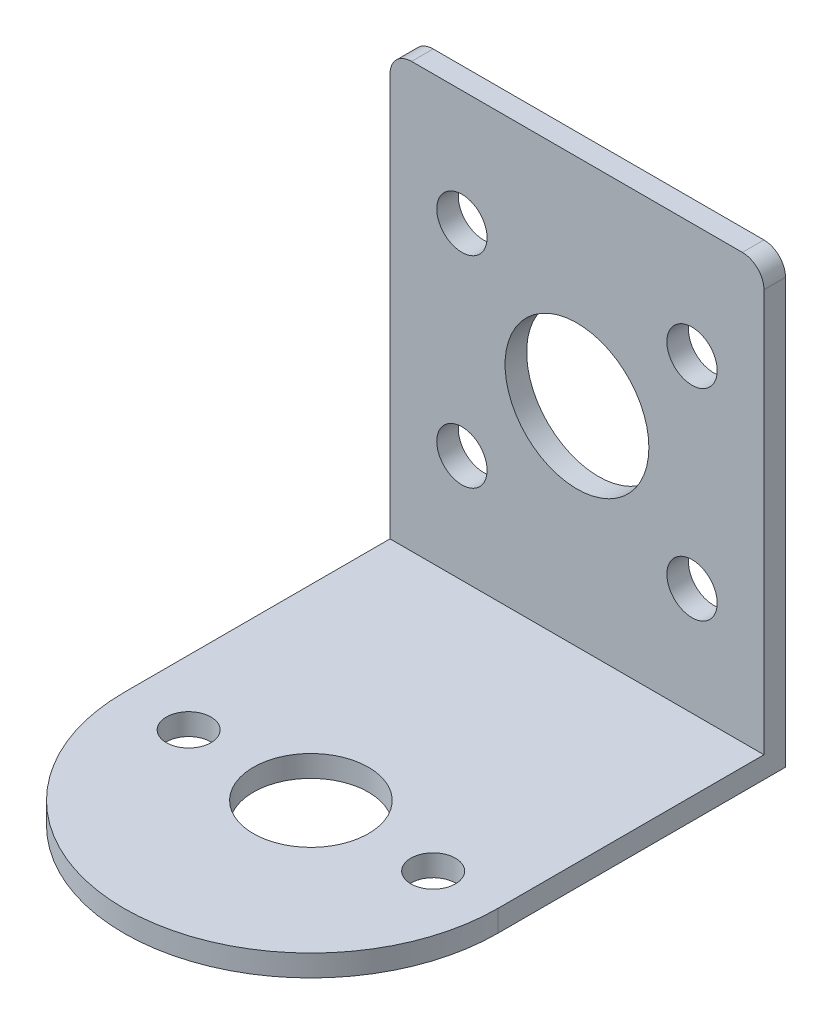
ISO-10303-21;
HEADER;
FILE_DESCRIPTION(('STEP AP214'),'2;1');
FILE_NAME('part.step','',(''),(''),'','','');
FILE_SCHEMA(('AUTOMOTIVE_DESIGN { 1 0 10303 214 1 1 1 1 }'));
ENDSEC;
DATA;
#1=APPLICATION_CONTEXT('core data for automotive mechanical design processes');
#2=APPLICATION_PROTOCOL_DEFINITION('international standard','automotive_design',2000,#1);
#3=PRODUCT_CONTEXT('',#1,'mechanical');
#4=PRODUCT('Part','Part','',(#3));
#5=PRODUCT_RELATED_PRODUCT_CATEGORY('part','',(#4));
#6=PRODUCT_DEFINITION_FORMATION('','',#4);
#7=PRODUCT_DEFINITION_CONTEXT('part definition',#1,'design');
#8=PRODUCT_DEFINITION('design','',#6,#7);
#9=PRODUCT_DEFINITION_SHAPE('','',#8);
#10=(LENGTH_UNIT() NAMED_UNIT(*) SI_UNIT(.MILLI.,.METRE.));
#11=(NAMED_UNIT(*) PLANE_ANGLE_UNIT() SI_UNIT($,.RADIAN.));
#12=(NAMED_UNIT(*) SI_UNIT($,.STERADIAN.) SOLID_ANGLE_UNIT());
#13=UNCERTAINTY_MEASURE_WITH_UNIT(LENGTH_MEASURE(1.E-05),#10,'distance_accuracy_value','');
#14=(GEOMETRIC_REPRESENTATION_CONTEXT(3) GLOBAL_UNCERTAINTY_ASSIGNED_CONTEXT((#13)) GLOBAL_UNIT_ASSIGNED_CONTEXT((#10,
#11,#12)) REPRESENTATION_CONTEXT('',''));
#15=CARTESIAN_POINT('',(0.,0.,0.));
#16=DIRECTION('',(0.,0.,1.));
#17=DIRECTION('',(1.,0.,0.));
#18=AXIS2_PLACEMENT_3D('',#15,#16,#17);
#19=CARTESIAN_POINT('',(0.,0.,1.5));
#20=DIRECTION('',(0.,0.,1.));
#21=DIRECTION('',(1.,0.,0.));
#22=AXIS2_PLACEMENT_3D('',#19,#20,#21);
#23=PLANE('',#22);
#24=CARTESIAN_POINT('',(8.,-6.5,1.5));
#25=DIRECTION('',(0.,0.,1.));
#26=DIRECTION('',(-1.,0.,0.));
#27=AXIS2_PLACEMENT_3D('',#24,#25,#26);
#28=CIRCLE('',#27,1.75);
#29=CARTESIAN_POINT('',(6.25,-6.5,1.5));
#30=VERTEX_POINT('',#29);
#31=EDGE_CURVE('E436',#30,#30,#28,.T.);
#32=ORIENTED_EDGE('',*,*,#31,.F.);
#33=EDGE_LOOP('',(#32));
#34=FACE_BOUND('',#33,.T.);
#35=CARTESIAN_POINT('',(-8.,-6.5,1.5));
#36=DIRECTION('',(0.,0.,1.));
#37=DIRECTION('',(-1.,0.,0.));
#38=AXIS2_PLACEMENT_3D('',#35,#36,#37);
#39=CIRCLE('',#38,1.75);
#40=CARTESIAN_POINT('',(-9.75,-6.5,1.5));
#41=VERTEX_POINT('',#40);
#42=EDGE_CURVE('E438',#41,#41,#39,.T.);
#43=ORIENTED_EDGE('',*,*,#42,.F.);
#44=EDGE_LOOP('',(#43));
#45=FACE_BOUND('',#44,.T.);
#46=CARTESIAN_POINT('',(8.,7.5,1.5));
#47=DIRECTION('',(0.,0.,1.));
#48=DIRECTION('',(1.,0.,0.));
#49=AXIS2_PLACEMENT_3D('',#46,#47,#48);
#50=CIRCLE('',#49,1.75);
#51=CARTESIAN_POINT('',(9.75,7.5,1.5));
#52=VERTEX_POINT('',#51);
#53=EDGE_CURVE('E442',#52,#52,#50,.T.);
#54=ORIENTED_EDGE('',*,*,#53,.F.);
#55=EDGE_LOOP('',(#54));
#56=FACE_BOUND('',#55,.T.);
#57=CARTESIAN_POINT('',(-8.,7.5,1.5));
#58=DIRECTION('',(0.,0.,1.));
#59=DIRECTION('',(1.,0.,0.));
#60=AXIS2_PLACEMENT_3D('',#57,#58,#59);
#61=CIRCLE('',#60,1.75);
#62=CARTESIAN_POINT('',(-6.25,7.5,1.5));
#63=VERTEX_POINT('',#62);
#64=EDGE_CURVE('E447',#63,#63,#61,.T.);
#65=ORIENTED_EDGE('',*,*,#64,.F.);
#66=EDGE_LOOP('',(#65));
#67=FACE_BOUND('',#66,.T.);
#68=CARTESIAN_POINT('',(0.,0.499999999999996,1.5));
#69=DIRECTION('',(0.,0.,1.));
#70=DIRECTION('',(1.,0.,0.));
#71=AXIS2_PLACEMENT_3D('',#68,#69,#70);
#72=CIRCLE('',#71,5.);
#73=CARTESIAN_POINT('',(5.,0.499999999999996,1.5));
#74=VERTEX_POINT('',#73);
#75=EDGE_CURVE('E212',#74,#74,#72,.T.);
#76=ORIENTED_EDGE('',*,*,#75,.F.);
#77=EDGE_LOOP('',(#76));
#78=FACE_BOUND('',#77,.T.);
#79=DIRECTION('',(0.,1.,0.));
#80=VECTOR('',#79,1.);
#81=CARTESIAN_POINT('',(13.,15.5,1.5));
#82=LINE('',#81,#80);
#83=CARTESIAN_POINT('',(13.,-14.,1.5));
#84=VERTEX_POINT('',#83);
#85=CARTESIAN_POINT('',(13.,14.,1.5));
#86=VERTEX_POINT('',#85);
#87=EDGE_CURVE('E116',#84,#86,#82,.T.);
#88=ORIENTED_EDGE('',*,*,#87,.T.);
#89=CARTESIAN_POINT('',(11.5,14.,1.5));
#90=DIRECTION('',(0.,0.,1.));
#91=DIRECTION('',(1.,0.,0.));
#92=AXIS2_PLACEMENT_3D('',#89,#90,#91);
#93=CIRCLE('',#92,1.5);
#94=CARTESIAN_POINT('',(11.5,15.5,1.5));
#95=VERTEX_POINT('',#94);
#96=EDGE_CURVE('E50',#86,#95,#93,.T.);
#97=ORIENTED_EDGE('',*,*,#96,.T.);
#98=DIRECTION('',(-1.,0.,0.));
#99=VECTOR('',#98,1.);
#100=CARTESIAN_POINT('',(-13.,15.5,1.5));
#101=LINE('',#100,#99);
#102=CARTESIAN_POINT('',(-11.5,15.5,1.5));
#103=VERTEX_POINT('',#102);
#104=EDGE_CURVE('E151',#95,#103,#101,.T.);
#105=ORIENTED_EDGE('',*,*,#104,.T.);
#106=CARTESIAN_POINT('',(-11.5,14.,1.5));
#107=DIRECTION('',(0.,0.,1.));
#108=DIRECTION('',(1.,0.,0.));
#109=AXIS2_PLACEMENT_3D('',#106,#107,#108);
#110=CIRCLE('',#109,1.5);
#111=CARTESIAN_POINT('',(-13.,14.,1.5));
#112=VERTEX_POINT('',#111);
#113=EDGE_CURVE('E58',#103,#112,#110,.T.);
#114=ORIENTED_EDGE('',*,*,#113,.T.);
#115=DIRECTION('',(0.,-1.,0.));
#116=VECTOR('',#115,1.);
#117=CARTESIAN_POINT('',(-13.,15.5,1.5));
#118=LINE('',#117,#116);
#119=CARTESIAN_POINT('',(-13.,-14.,1.5));
#120=VERTEX_POINT('',#119);
#121=EDGE_CURVE('E155',#112,#120,#118,.T.);
#122=ORIENTED_EDGE('',*,*,#121,.T.);
#123=DIRECTION('',(1.,0.,0.));
#124=VECTOR('',#123,1.);
#125=CARTESIAN_POINT('',(0.,-14.,1.5));
#126=LINE('',#125,#124);
#127=EDGE_CURVE('E144',#120,#84,#126,.T.);
#128=ORIENTED_EDGE('',*,*,#127,.T.);
#129=EDGE_LOOP('',(#88,#97,#105,#114,#122,#128));
#130=FACE_BOUND('',#129,.T.);
#131=ADVANCED_FACE('F40',(#34,#45,#56,#67,#78,#130),#23,.T.);
#132=CARTESIAN_POINT('',(13.,15.5,1.5));
#133=DIRECTION('',(-1.,0.,0.));
#134=DIRECTION('',(0.,-1.,0.));
#135=AXIS2_PLACEMENT_3D('',#132,#133,#134);
#136=PLANE('',#135);
#137=DIRECTION('',(0.,1.,0.));
#138=VECTOR('',#137,1.);
#139=CARTESIAN_POINT('',(13.,15.5,0.));
#140=LINE('',#139,#138);
#141=CARTESIAN_POINT('',(13.,-15.5,0.));
#142=VERTEX_POINT('',#141);
#143=CARTESIAN_POINT('',(13.,14.,0.));
#144=VERTEX_POINT('',#143);
#145=EDGE_CURVE('E148',#142,#144,#140,.T.);
#146=ORIENTED_EDGE('',*,*,#145,.T.);
#147=DIRECTION('',(0.,0.,-1.));
#148=VECTOR('',#147,1.);
#149=CARTESIAN_POINT('',(13.,14.,1.5));
#150=LINE('',#149,#148);
#151=EDGE_CURVE('E66',#144,#86,#150,.F.);
#152=ORIENTED_EDGE('',*,*,#151,.T.);
#153=ORIENTED_EDGE('',*,*,#87,.F.);
#154=DIRECTION('',(0.,0.,1.));
#155=VECTOR('',#154,1.);
#156=CARTESIAN_POINT('',(13.,-14.,0.));
#157=LINE('',#156,#155);
#158=CARTESIAN_POINT('',(13.,-14.,20.));
#159=VERTEX_POINT('',#158);
#160=EDGE_CURVE('E110',#84,#159,#157,.T.);
#161=ORIENTED_EDGE('',*,*,#160,.T.);
#162=DIRECTION('',(0.,-1.,0.));
#163=VECTOR('',#162,1.);
#164=CARTESIAN_POINT('',(13.,-14.,20.));
#165=LINE('',#164,#163);
#166=CARTESIAN_POINT('',(13.,-15.5,20.));
#167=VERTEX_POINT('',#166);
#168=EDGE_CURVE('E114',#159,#167,#165,.T.);
#169=ORIENTED_EDGE('',*,*,#168,.T.);
#170=DIRECTION('',(0.,0.,-1.));
#171=VECTOR('',#170,1.);
#172=CARTESIAN_POINT('',(13.,-15.5,1.5));
#173=LINE('',#172,#171);
#174=EDGE_CURVE('E158',#167,#142,#173,.T.);
#175=ORIENTED_EDGE('',*,*,#174,.T.);
#176=EDGE_LOOP('',(#146,#152,#153,#161,#169,#175));
#177=FACE_BOUND('',#176,.T.);
#178=ADVANCED_FACE('F112',(#177),#136,.F.);
#179=CARTESIAN_POINT('',(-13.,15.5,1.5));
#180=DIRECTION('',(0.,-1.,0.));
#181=DIRECTION('',(0.,0.,-1.));
#182=AXIS2_PLACEMENT_3D('',#179,#180,#181);
#183=PLANE('',#182);
#184=ORIENTED_EDGE('',*,*,#104,.F.);
#185=DIRECTION('',(0.,0.,-1.));
#186=VECTOR('',#185,1.);
#187=CARTESIAN_POINT('',(11.5,15.5,1.5));
#188=LINE('',#187,#186);
#189=CARTESIAN_POINT('',(11.5,15.5,0.));
#190=VERTEX_POINT('',#189);
#191=EDGE_CURVE('E191',#95,#190,#188,.T.);
#192=ORIENTED_EDGE('',*,*,#191,.T.);
#193=DIRECTION('',(-1.,0.,0.));
#194=VECTOR('',#193,1.);
#195=CARTESIAN_POINT('',(-13.,15.5,0.));
#196=LINE('',#195,#194);
#197=CARTESIAN_POINT('',(-11.5,15.5,0.));
#198=VERTEX_POINT('',#197);
#199=EDGE_CURVE('E161',#190,#198,#196,.T.);
#200=ORIENTED_EDGE('',*,*,#199,.T.);
#201=DIRECTION('',(0.,0.,-1.));
#202=VECTOR('',#201,1.);
#203=CARTESIAN_POINT('',(-11.5,15.5,1.5));
#204=LINE('',#203,#202);
#205=EDGE_CURVE('E176',#198,#103,#204,.F.);
#206=ORIENTED_EDGE('',*,*,#205,.T.);
#207=EDGE_LOOP('',(#184,#192,#200,#206));
#208=FACE_BOUND('',#207,.T.);
#209=ADVANCED_FACE('F260',(#208),#183,.F.);
#210=CARTESIAN_POINT('',(-13.,15.5,1.5));
#211=DIRECTION('',(1.,0.,0.));
#212=DIRECTION('',(0.,1.,0.));
#213=AXIS2_PLACEMENT_3D('',#210,#211,#212);
#214=PLANE('',#213);
#215=ORIENTED_EDGE('',*,*,#121,.F.);
#216=DIRECTION('',(0.,0.,-1.));
#217=VECTOR('',#216,1.);
#218=CARTESIAN_POINT('',(-13.,14.,1.5));
#219=LINE('',#218,#217);
#220=CARTESIAN_POINT('',(-13.,14.,0.));
#221=VERTEX_POINT('',#220);
#222=EDGE_CURVE('E11',#112,#221,#219,.T.);
#223=ORIENTED_EDGE('',*,*,#222,.T.);
#224=DIRECTION('',(0.,-1.,0.));
#225=VECTOR('',#224,1.);
#226=CARTESIAN_POINT('',(-13.,15.5,0.));
#227=LINE('',#226,#225);
#228=CARTESIAN_POINT('',(-13.,-15.5,0.));
#229=VERTEX_POINT('',#228);
#230=EDGE_CURVE('E165',#221,#229,#227,.T.);
#231=ORIENTED_EDGE('',*,*,#230,.T.);
#232=DIRECTION('',(0.,0.,-1.));
#233=VECTOR('',#232,1.);
#234=CARTESIAN_POINT('',(-13.,-15.5,1.5));
#235=LINE('',#234,#233);
#236=CARTESIAN_POINT('',(-13.,-15.5,20.));
#237=VERTEX_POINT('',#236);
#238=EDGE_CURVE('E172',#237,#229,#235,.T.);
#239=ORIENTED_EDGE('',*,*,#238,.F.);
#240=DIRECTION('',(0.,-1.,0.));
#241=VECTOR('',#240,1.);
#242=CARTESIAN_POINT('',(-13.,-14.,20.));
#243=LINE('',#242,#241);
#244=CARTESIAN_POINT('',(-13.,-14.,20.));
#245=VERTEX_POINT('',#244);
#246=EDGE_CURVE('E131',#245,#237,#243,.T.);
#247=ORIENTED_EDGE('',*,*,#246,.F.);
#248=DIRECTION('',(0.,0.,-1.));
#249=VECTOR('',#248,1.);
#250=CARTESIAN_POINT('',(-13.,-14.,0.));
#251=LINE('',#250,#249);
#252=EDGE_CURVE('E122',#245,#120,#251,.T.);
#253=ORIENTED_EDGE('',*,*,#252,.T.);
#254=EDGE_LOOP('',(#215,#223,#231,#239,#247,#253));
#255=FACE_BOUND('',#254,.T.);
#256=ADVANCED_FACE('F244',(#255),#214,.F.);
#257=CARTESIAN_POINT('',(-13.,-15.5,1.5));
#258=DIRECTION('',(0.,1.,0.));
#259=DIRECTION('',(0.,0.,1.));
#260=AXIS2_PLACEMENT_3D('',#257,#258,#259);
#261=PLANE('',#260);
#262=CARTESIAN_POINT('',(-8.5,-15.5,20.));
#263=DIRECTION('',(0.,-1.,0.));
#264=DIRECTION('',(0.,0.,-1.));
#265=AXIS2_PLACEMENT_3D('',#262,#263,#264);
#266=CIRCLE('',#265,1.55);
#267=CARTESIAN_POINT('',(-8.5,-15.5,18.45));
#268=VERTEX_POINT('',#267);
#269=EDGE_CURVE('E226',#268,#268,#266,.T.);
#270=ORIENTED_EDGE('',*,*,#269,.F.);
#271=EDGE_LOOP('',(#270));
#272=FACE_BOUND('',#271,.T.);
#273=CARTESIAN_POINT('',(8.5,-15.5,20.));
#274=DIRECTION('',(0.,-1.,0.));
#275=DIRECTION('',(0.,0.,-1.));
#276=AXIS2_PLACEMENT_3D('',#273,#274,#275);
#277=CIRCLE('',#276,1.55);
#278=CARTESIAN_POINT('',(8.5,-15.5,18.45));
#279=VERTEX_POINT('',#278);
#280=EDGE_CURVE('E231',#279,#279,#277,.T.);
#281=ORIENTED_EDGE('',*,*,#280,.F.);
#282=EDGE_LOOP('',(#281));
#283=FACE_BOUND('',#282,.T.);
#284=CARTESIAN_POINT('',(0.,-15.5,20.));
#285=DIRECTION('',(0.,-1.,0.));
#286=DIRECTION('',(0.,0.,-1.));
#287=AXIS2_PLACEMENT_3D('',#284,#285,#286);
#288=CIRCLE('',#287,4.);
#289=CARTESIAN_POINT('',(0.,-15.5,16.));
#290=VERTEX_POINT('',#289);
#291=EDGE_CURVE('E182',#290,#290,#288,.T.);
#292=ORIENTED_EDGE('',*,*,#291,.F.);
#293=EDGE_LOOP('',(#292));
#294=FACE_BOUND('',#293,.T.);
#295=DIRECTION('',(1.,0.,0.));
#296=VECTOR('',#295,1.);
#297=CARTESIAN_POINT('',(-13.,-15.5,0.));
#298=LINE('',#297,#296);
#299=EDGE_CURVE('E152',#229,#142,#298,.T.);
#300=ORIENTED_EDGE('',*,*,#299,.T.);
#301=ORIENTED_EDGE('',*,*,#174,.F.);
#302=CARTESIAN_POINT('',(0.,-15.5,20.));
#303=DIRECTION('',(0.,-1.,0.));
#304=DIRECTION('',(0.,0.,-1.));
#305=AXIS2_PLACEMENT_3D('',#302,#303,#304);
#306=CIRCLE('',#305,13.);
#307=EDGE_CURVE('E129',#167,#237,#306,.T.);
#308=ORIENTED_EDGE('',*,*,#307,.T.);
#309=ORIENTED_EDGE('',*,*,#238,.T.);
#310=EDGE_LOOP('',(#300,#301,#308,#309));
#311=FACE_BOUND('',#310,.T.);
#312=ADVANCED_FACE('F247',(#272,#283,#294,#311),#261,.F.);
#313=CARTESIAN_POINT('',(0.,0.,0.));
#314=DIRECTION('',(0.,0.,1.));
#315=DIRECTION('',(1.,0.,0.));
#316=AXIS2_PLACEMENT_3D('',#313,#314,#315);
#317=PLANE('',#316);
#318=CARTESIAN_POINT('',(8.,-6.5,0.));
#319=DIRECTION('',(0.,0.,1.));
#320=DIRECTION('',(1.,0.,0.));
#321=AXIS2_PLACEMENT_3D('',#318,#319,#320);
#322=CIRCLE('',#321,1.75);
#323=CARTESIAN_POINT('',(9.75,-6.5,0.));
#324=VERTEX_POINT('',#323);
#325=EDGE_CURVE('E44',#324,#324,#322,.T.);
#326=ORIENTED_EDGE('',*,*,#325,.T.);
#327=EDGE_LOOP('',(#326));
#328=FACE_BOUND('',#327,.T.);
#329=CARTESIAN_POINT('',(-8.,-6.5,0.));
#330=DIRECTION('',(0.,0.,1.));
#331=DIRECTION('',(1.,0.,0.));
#332=AXIS2_PLACEMENT_3D('',#329,#330,#331);
#333=CIRCLE('',#332,1.75);
#334=CARTESIAN_POINT('',(-6.25,-6.5,0.));
#335=VERTEX_POINT('',#334);
#336=EDGE_CURVE('E219',#335,#335,#333,.T.);
#337=ORIENTED_EDGE('',*,*,#336,.T.);
#338=EDGE_LOOP('',(#337));
#339=FACE_BOUND('',#338,.T.);
#340=CARTESIAN_POINT('',(8.,7.5,0.));
#341=DIRECTION('',(0.,0.,1.));
#342=DIRECTION('',(1.,0.,0.));
#343=AXIS2_PLACEMENT_3D('',#340,#341,#342);
#344=CIRCLE('',#343,1.75);
#345=CARTESIAN_POINT('',(9.75,7.5,0.));
#346=VERTEX_POINT('',#345);
#347=EDGE_CURVE('E216',#346,#346,#344,.T.);
#348=ORIENTED_EDGE('',*,*,#347,.T.);
#349=EDGE_LOOP('',(#348));
#350=FACE_BOUND('',#349,.T.);
#351=CARTESIAN_POINT('',(-8.,7.5,0.));
#352=DIRECTION('',(0.,0.,1.));
#353=DIRECTION('',(1.,0.,0.));
#354=AXIS2_PLACEMENT_3D('',#351,#352,#353);
#355=CIRCLE('',#354,1.75);
#356=CARTESIAN_POINT('',(-6.25,7.5,0.));
#357=VERTEX_POINT('',#356);
#358=EDGE_CURVE('E211',#357,#357,#355,.T.);
#359=ORIENTED_EDGE('',*,*,#358,.T.);
#360=EDGE_LOOP('',(#359));
#361=FACE_BOUND('',#360,.T.);
#362=CARTESIAN_POINT('',(0.,0.499999999999996,0.));
#363=DIRECTION('',(0.,0.,1.));
#364=DIRECTION('',(1.,0.,0.));
#365=AXIS2_PLACEMENT_3D('',#362,#363,#364);
#366=CIRCLE('',#365,5.);
#367=CARTESIAN_POINT('',(5.,0.499999999999996,0.));
#368=VERTEX_POINT('',#367);
#369=EDGE_CURVE('E207',#368,#368,#366,.T.);
#370=ORIENTED_EDGE('',*,*,#369,.T.);
#371=EDGE_LOOP('',(#370));
#372=FACE_BOUND('',#371,.T.);
#373=ORIENTED_EDGE('',*,*,#199,.F.);
#374=CARTESIAN_POINT('',(11.5,14.,0.));
#375=DIRECTION('',(0.,0.,1.));
#376=DIRECTION('',(1.,0.,0.));
#377=AXIS2_PLACEMENT_3D('',#374,#375,#376);
#378=CIRCLE('',#377,1.5);
#379=EDGE_CURVE('E198',#190,#144,#378,.F.);
#380=ORIENTED_EDGE('',*,*,#379,.T.);
#381=ORIENTED_EDGE('',*,*,#145,.F.);
#382=ORIENTED_EDGE('',*,*,#299,.F.);
#383=ORIENTED_EDGE('',*,*,#230,.F.);
#384=CARTESIAN_POINT('',(-11.5,14.,0.));
#385=DIRECTION('',(0.,0.,1.));
#386=DIRECTION('',(1.,0.,0.));
#387=AXIS2_PLACEMENT_3D('',#384,#385,#386);
#388=CIRCLE('',#387,1.5);
#389=EDGE_CURVE('E195',#221,#198,#388,.F.);
#390=ORIENTED_EDGE('',*,*,#389,.T.);
#391=EDGE_LOOP('',(#373,#380,#381,#382,#383,#390));
#392=FACE_BOUND('',#391,.T.);
#393=ADVANCED_FACE('F252',(#328,#339,#350,#361,#372,#392),#317,.F.);
#394=CARTESIAN_POINT('',(0.,-14.,20.));
#395=DIRECTION('',(0.,-1.,0.));
#396=DIRECTION('',(0.,0.,-1.));
#397=AXIS2_PLACEMENT_3D('',#394,#395,#396);
#398=CYLINDRICAL_SURFACE('',#397,13.);
#399=ORIENTED_EDGE('',*,*,#307,.F.);
#400=ORIENTED_EDGE('',*,*,#168,.F.);
#401=CARTESIAN_POINT('',(0.,-14.,20.));
#402=DIRECTION('',(0.,-1.,0.));
#403=DIRECTION('',(0.,0.,-1.));
#404=AXIS2_PLACEMENT_3D('',#401,#402,#403);
#405=CIRCLE('',#404,13.);
#406=EDGE_CURVE('E121',#159,#245,#405,.T.);
#407=ORIENTED_EDGE('',*,*,#406,.T.);
#408=ORIENTED_EDGE('',*,*,#246,.T.);
#409=EDGE_LOOP('',(#399,#400,#407,#408));
#410=FACE_BOUND('',#409,.T.);
#411=ADVANCED_FACE('F126',(#410),#398,.T.);
#412=CARTESIAN_POINT('',(0.,-14.,20.));
#413=DIRECTION('',(0.,-1.,0.));
#414=DIRECTION('',(0.,0.,-1.));
#415=AXIS2_PLACEMENT_3D('',#412,#413,#414);
#416=PLANE('',#415);
#417=CARTESIAN_POINT('',(-8.5,-14.,20.));
#418=DIRECTION('',(0.,-1.,0.));
#419=DIRECTION('',(0.,0.,-1.));
#420=AXIS2_PLACEMENT_3D('',#417,#418,#419);
#421=CIRCLE('',#420,1.55);
#422=CARTESIAN_POINT('',(-8.5,-14.,18.45));
#423=VERTEX_POINT('',#422);
#424=EDGE_CURVE('E142',#423,#423,#421,.T.);
#425=ORIENTED_EDGE('',*,*,#424,.T.);
#426=EDGE_LOOP('',(#425));
#427=FACE_BOUND('',#426,.T.);
#428=CARTESIAN_POINT('',(8.5,-14.,20.));
#429=DIRECTION('',(0.,-1.,0.));
#430=DIRECTION('',(0.,0.,-1.));
#431=AXIS2_PLACEMENT_3D('',#428,#429,#430);
#432=CIRCLE('',#431,1.55);
#433=CARTESIAN_POINT('',(8.5,-14.,18.45));
#434=VERTEX_POINT('',#433);
#435=EDGE_CURVE('E181',#434,#434,#432,.T.);
#436=ORIENTED_EDGE('',*,*,#435,.T.);
#437=EDGE_LOOP('',(#436));
#438=FACE_BOUND('',#437,.T.);
#439=CARTESIAN_POINT('',(0.,-14.,20.));
#440=DIRECTION('',(0.,-1.,0.));
#441=DIRECTION('',(0.,0.,-1.));
#442=AXIS2_PLACEMENT_3D('',#439,#440,#441);
#443=CIRCLE('',#442,4.);
#444=CARTESIAN_POINT('',(0.,-14.,16.));
#445=VERTEX_POINT('',#444);
#446=EDGE_CURVE('E177',#445,#445,#443,.T.);
#447=ORIENTED_EDGE('',*,*,#446,.T.);
#448=EDGE_LOOP('',(#447));
#449=FACE_BOUND('',#448,.T.);
#450=ORIENTED_EDGE('',*,*,#127,.F.);
#451=ORIENTED_EDGE('',*,*,#252,.F.);
#452=ORIENTED_EDGE('',*,*,#406,.F.);
#453=ORIENTED_EDGE('',*,*,#160,.F.);
#454=EDGE_LOOP('',(#450,#451,#452,#453));
#455=FACE_BOUND('',#454,.T.);
#456=ADVANCED_FACE('F134',(#427,#438,#449,#455),#416,.F.);
#457=CARTESIAN_POINT('',(0.,984.5,20.));
#458=DIRECTION('',(0.,-1.,0.));
#459=DIRECTION('',(0.,0.,-1.));
#460=AXIS2_PLACEMENT_3D('',#457,#458,#459);
#461=CYLINDRICAL_SURFACE('',#460,4.);
#462=ORIENTED_EDGE('',*,*,#291,.T.);
#463=EDGE_LOOP('',(#462));
#464=FACE_BOUND('',#463,.T.);
#465=ORIENTED_EDGE('',*,*,#446,.F.);
#466=EDGE_LOOP('',(#465));
#467=FACE_BOUND('',#466,.T.);
#468=ADVANCED_FACE('F322',(#464,#467),#461,.F.);
#469=CARTESIAN_POINT('',(8.5,984.5,20.));
#470=DIRECTION('',(0.,-1.,0.));
#471=DIRECTION('',(0.,0.,-1.));
#472=AXIS2_PLACEMENT_3D('',#469,#470,#471);
#473=CYLINDRICAL_SURFACE('',#472,1.55);
#474=ORIENTED_EDGE('',*,*,#280,.T.);
#475=EDGE_LOOP('',(#474));
#476=FACE_BOUND('',#475,.T.);
#477=ORIENTED_EDGE('',*,*,#435,.F.);
#478=EDGE_LOOP('',(#477));
#479=FACE_BOUND('',#478,.T.);
#480=ADVANCED_FACE('F329',(#476,#479),#473,.F.);
#481=CARTESIAN_POINT('',(-8.5,984.5,20.));
#482=DIRECTION('',(0.,-1.,0.));
#483=DIRECTION('',(0.,0.,-1.));
#484=AXIS2_PLACEMENT_3D('',#481,#482,#483);
#485=CYLINDRICAL_SURFACE('',#484,1.55);
#486=ORIENTED_EDGE('',*,*,#269,.T.);
#487=EDGE_LOOP('',(#486));
#488=FACE_BOUND('',#487,.T.);
#489=ORIENTED_EDGE('',*,*,#424,.F.);
#490=EDGE_LOOP('',(#489));
#491=FACE_BOUND('',#490,.T.);
#492=ADVANCED_FACE('F272',(#488,#491),#485,.F.);
#493=CARTESIAN_POINT('',(11.5,14.,1.5));
#494=DIRECTION('',(0.,0.,-1.));
#495=DIRECTION('',(-1.,0.,0.));
#496=AXIS2_PLACEMENT_3D('',#493,#494,#495);
#497=CYLINDRICAL_SURFACE('',#496,1.5);
#498=ORIENTED_EDGE('',*,*,#96,.F.);
#499=ORIENTED_EDGE('',*,*,#151,.F.);
#500=ORIENTED_EDGE('',*,*,#379,.F.);
#501=ORIENTED_EDGE('',*,*,#191,.F.);
#502=EDGE_LOOP('',(#498,#499,#500,#501));
#503=FACE_BOUND('',#502,.T.);
#504=ADVANCED_FACE('F257',(#503),#497,.T.);
#505=CARTESIAN_POINT('',(-11.5,14.,1.5));
#506=DIRECTION('',(0.,0.,-1.));
#507=DIRECTION('',(-1.,0.,0.));
#508=AXIS2_PLACEMENT_3D('',#505,#506,#507);
#509=CYLINDRICAL_SURFACE('',#508,1.5);
#510=ORIENTED_EDGE('',*,*,#113,.F.);
#511=ORIENTED_EDGE('',*,*,#205,.F.);
#512=ORIENTED_EDGE('',*,*,#389,.F.);
#513=ORIENTED_EDGE('',*,*,#222,.F.);
#514=EDGE_LOOP('',(#510,#511,#512,#513));
#515=FACE_BOUND('',#514,.T.);
#516=ADVANCED_FACE('F42',(#515),#509,.T.);
#517=CARTESIAN_POINT('',(0.,0.499999999999996,-98.5));
#518=DIRECTION('',(0.,0.,1.));
#519=DIRECTION('',(1.,0.,0.));
#520=AXIS2_PLACEMENT_3D('',#517,#518,#519);
#521=CYLINDRICAL_SURFACE('',#520,5.);
#522=ORIENTED_EDGE('',*,*,#75,.T.);
#523=EDGE_LOOP('',(#522));
#524=FACE_BOUND('',#523,.T.);
#525=ORIENTED_EDGE('',*,*,#369,.F.);
#526=EDGE_LOOP('',(#525));
#527=FACE_BOUND('',#526,.T.);
#528=ADVANCED_FACE('F264',(#524,#527),#521,.F.);
#529=CARTESIAN_POINT('',(-8.,7.5,-98.5));
#530=DIRECTION('',(0.,0.,1.));
#531=DIRECTION('',(1.,0.,0.));
#532=AXIS2_PLACEMENT_3D('',#529,#530,#531);
#533=CYLINDRICAL_SURFACE('',#532,1.75);
#534=ORIENTED_EDGE('',*,*,#64,.T.);
#535=EDGE_LOOP('',(#534));
#536=FACE_BOUND('',#535,.T.);
#537=ORIENTED_EDGE('',*,*,#358,.F.);
#538=EDGE_LOOP('',(#537));
#539=FACE_BOUND('',#538,.T.);
#540=ADVANCED_FACE('F269',(#536,#539),#533,.F.);
#541=CARTESIAN_POINT('',(8.,7.5,-98.5));
#542=DIRECTION('',(0.,0.,1.));
#543=DIRECTION('',(1.,0.,0.));
#544=AXIS2_PLACEMENT_3D('',#541,#542,#543);
#545=CYLINDRICAL_SURFACE('',#544,1.75);
#546=ORIENTED_EDGE('',*,*,#53,.T.);
#547=EDGE_LOOP('',(#546));
#548=FACE_BOUND('',#547,.T.);
#549=ORIENTED_EDGE('',*,*,#347,.F.);
#550=EDGE_LOOP('',(#549));
#551=FACE_BOUND('',#550,.T.);
#552=ADVANCED_FACE('F400',(#548,#551),#545,.F.);
#553=CARTESIAN_POINT('',(-8.,-6.5,-98.5));
#554=DIRECTION('',(0.,0.,1.));
#555=DIRECTION('',(1.,0.,0.));
#556=AXIS2_PLACEMENT_3D('',#553,#554,#555);
#557=CYLINDRICAL_SURFACE('',#556,1.75);
#558=ORIENTED_EDGE('',*,*,#42,.T.);
#559=EDGE_LOOP('',(#558));
#560=FACE_BOUND('',#559,.T.);
#561=ORIENTED_EDGE('',*,*,#336,.F.);
#562=EDGE_LOOP('',(#561));
#563=FACE_BOUND('',#562,.T.);
#564=ADVANCED_FACE('F409',(#560,#563),#557,.F.);
#565=CARTESIAN_POINT('',(8.,-6.5,-98.5));
#566=DIRECTION('',(0.,0.,1.));
#567=DIRECTION('',(1.,0.,0.));
#568=AXIS2_PLACEMENT_3D('',#565,#566,#567);
#569=CYLINDRICAL_SURFACE('',#568,1.75);
#570=ORIENTED_EDGE('',*,*,#31,.T.);
#571=EDGE_LOOP('',(#570));
#572=FACE_BOUND('',#571,.T.);
#573=ORIENTED_EDGE('',*,*,#325,.F.);
#574=EDGE_LOOP('',(#573));
#575=FACE_BOUND('',#574,.T.);
#576=ADVANCED_FACE('F418',(#572,#575),#569,.F.);
#577=CLOSED_SHELL('',(#131,#178,#209,#256,#312,#393,#411,#456,#468,#480,#492,#504,#516,#528,
#540,#552,#564,#576));
#578=MANIFOLD_SOLID_BREP('B2',#577);
#579=ADVANCED_BREP_SHAPE_REPRESENTATION('',(#18,#578),#14);
#580=SHAPE_DEFINITION_REPRESENTATION(#9,#579);
ENDSEC;
END-ISO-10303-21;
